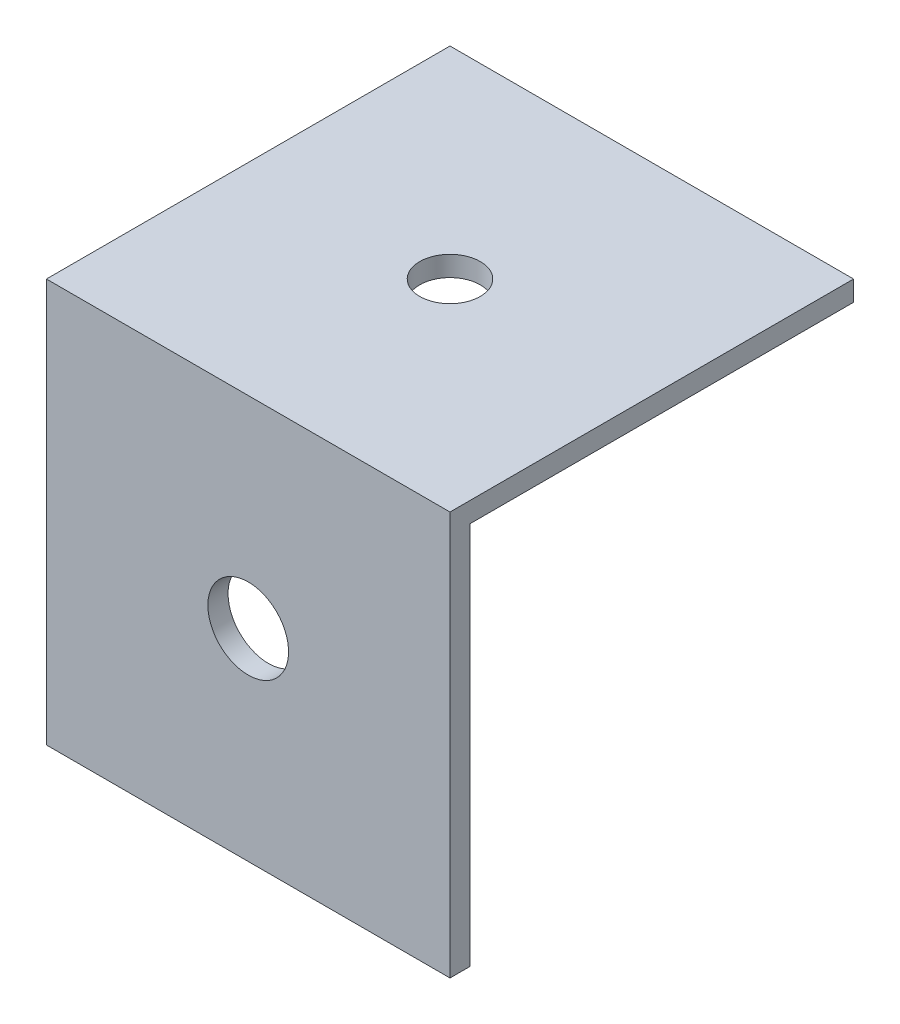
ISO-10303-21;
HEADER;
FILE_DESCRIPTION(('STEP AP214'),'2;1');
FILE_NAME('part.step','',(''),(''),'','','');
FILE_SCHEMA(('AUTOMOTIVE_DESIGN { 1 0 10303 214 1 1 1 1 }'));
ENDSEC;
DATA;
#1=APPLICATION_CONTEXT('core data for automotive mechanical design processes');
#2=APPLICATION_PROTOCOL_DEFINITION('international standard','automotive_design',2000,#1);
#3=PRODUCT_CONTEXT('',#1,'mechanical');
#4=PRODUCT('Part','Part','',(#3));
#5=PRODUCT_RELATED_PRODUCT_CATEGORY('part','',(#4));
#6=PRODUCT_DEFINITION_FORMATION('','',#4);
#7=PRODUCT_DEFINITION_CONTEXT('part definition',#1,'design');
#8=PRODUCT_DEFINITION('design','',#6,#7);
#9=PRODUCT_DEFINITION_SHAPE('','',#8);
#10=(LENGTH_UNIT() NAMED_UNIT(*) SI_UNIT(.MILLI.,.METRE.));
#11=(NAMED_UNIT(*) PLANE_ANGLE_UNIT() SI_UNIT($,.RADIAN.));
#12=(NAMED_UNIT(*) SI_UNIT($,.STERADIAN.) SOLID_ANGLE_UNIT());
#13=UNCERTAINTY_MEASURE_WITH_UNIT(LENGTH_MEASURE(1.E-05),#10,'distance_accuracy_value','');
#14=(GEOMETRIC_REPRESENTATION_CONTEXT(3) GLOBAL_UNCERTAINTY_ASSIGNED_CONTEXT((#13)) GLOBAL_UNIT_ASSIGNED_CONTEXT((#10,
#11,#12)) REPRESENTATION_CONTEXT('',''));
#15=CARTESIAN_POINT('',(0.,0.,0.));
#16=DIRECTION('',(0.,0.,1.));
#17=DIRECTION('',(1.,0.,0.));
#18=AXIS2_PLACEMENT_3D('',#15,#16,#17);
#19=CARTESIAN_POINT('',(20.,0.,-1.));
#20=DIRECTION('',(0.,1.,0.));
#21=DIRECTION('',(0.,0.,1.));
#22=AXIS2_PLACEMENT_3D('',#19,#20,#21);
#23=PLANE('',#22);
#24=DIRECTION('',(0.,0.,-1.));
#25=VECTOR('',#24,1.);
#26=CARTESIAN_POINT('',(0.,0.,-1.));
#27=LINE('',#26,#25);
#28=CARTESIAN_POINT('',(0.,0.,0.));
#29=VERTEX_POINT('',#28);
#30=CARTESIAN_POINT('',(0.,0.,-1.));
#31=VERTEX_POINT('',#30);
#32=EDGE_CURVE('E117',#29,#31,#27,.T.);
#33=ORIENTED_EDGE('',*,*,#32,.T.);
#34=DIRECTION('',(-1.,0.,0.));
#35=VECTOR('',#34,1.);
#36=CARTESIAN_POINT('',(20.,0.,-1.));
#37=LINE('',#36,#35);
#38=CARTESIAN_POINT('',(20.,0.,-1.));
#39=VERTEX_POINT('',#38);
#40=EDGE_CURVE('E11',#39,#31,#37,.T.);
#41=ORIENTED_EDGE('',*,*,#40,.F.);
#42=DIRECTION('',(0.,0.,-1.));
#43=VECTOR('',#42,1.);
#44=CARTESIAN_POINT('',(20.,0.,-1.));
#45=LINE('',#44,#43);
#46=CARTESIAN_POINT('',(20.,0.,0.));
#47=VERTEX_POINT('',#46);
#48=EDGE_CURVE('E128',#47,#39,#45,.T.);
#49=ORIENTED_EDGE('',*,*,#48,.F.);
#50=DIRECTION('',(-1.,0.,0.));
#51=VECTOR('',#50,1.);
#52=CARTESIAN_POINT('',(20.,0.,0.));
#53=LINE('',#52,#51);
#54=EDGE_CURVE('E113',#47,#29,#53,.T.);
#55=ORIENTED_EDGE('',*,*,#54,.T.);
#56=EDGE_LOOP('',(#33,#41,#49,#55));
#57=FACE_BOUND('',#56,.T.);
#58=ADVANCED_FACE('F33',(#57),#23,.F.);
#59=CARTESIAN_POINT('',(20.,19.,-1.));
#60=DIRECTION('',(0.,0.,1.));
#61=DIRECTION('',(1.,0.,0.));
#62=AXIS2_PLACEMENT_3D('',#59,#60,#61);
#63=PLANE('',#62);
#64=CARTESIAN_POINT('',(10.,10.,-1.));
#65=DIRECTION('',(0.,0.,-1.));
#66=DIRECTION('',(-1.,0.,0.));
#67=AXIS2_PLACEMENT_3D('',#64,#65,#66);
#68=CIRCLE('',#67,2.);
#69=CARTESIAN_POINT('',(8.,10.,-1.));
#70=VERTEX_POINT('',#69);
#71=EDGE_CURVE('E234',#70,#70,#68,.T.);
#72=ORIENTED_EDGE('',*,*,#71,.F.);
#73=EDGE_LOOP('',(#72));
#74=FACE_BOUND('',#73,.T.);
#75=DIRECTION('',(0.,1.,0.));
#76=VECTOR('',#75,1.);
#77=CARTESIAN_POINT('',(0.,19.,-1.));
#78=LINE('',#77,#76);
#79=CARTESIAN_POINT('',(0.,19.,-1.));
#80=VERTEX_POINT('',#79);
#81=EDGE_CURVE('E120',#31,#80,#78,.T.);
#82=ORIENTED_EDGE('',*,*,#81,.T.);
#83=DIRECTION('',(-1.,0.,0.));
#84=VECTOR('',#83,1.);
#85=CARTESIAN_POINT('',(20.,19.,-1.));
#86=LINE('',#85,#84);
#87=CARTESIAN_POINT('',(20.,19.,-1.));
#88=VERTEX_POINT('',#87);
#89=EDGE_CURVE('E41',#88,#80,#86,.T.);
#90=ORIENTED_EDGE('',*,*,#89,.F.);
#91=DIRECTION('',(0.,1.,0.));
#92=VECTOR('',#91,1.);
#93=CARTESIAN_POINT('',(20.,19.,-1.));
#94=LINE('',#93,#92);
#95=EDGE_CURVE('E86',#39,#88,#94,.T.);
#96=ORIENTED_EDGE('',*,*,#95,.F.);
#97=ORIENTED_EDGE('',*,*,#40,.T.);
#98=EDGE_LOOP('',(#82,#90,#96,#97));
#99=FACE_BOUND('',#98,.T.);
#100=ADVANCED_FACE('F155',(#74,#99),#63,.F.);
#101=CARTESIAN_POINT('',(20.,19.,-20.));
#102=DIRECTION('',(0.,1.,0.));
#103=DIRECTION('',(0.,0.,1.));
#104=AXIS2_PLACEMENT_3D('',#101,#102,#103);
#105=PLANE('',#104);
#106=CARTESIAN_POINT('',(10.,19.,-10.));
#107=DIRECTION('',(0.,-1.,0.));
#108=DIRECTION('',(0.,0.,-1.));
#109=AXIS2_PLACEMENT_3D('',#106,#107,#108);
#110=CIRCLE('',#109,1.5);
#111=CARTESIAN_POINT('',(10.,19.,-11.5));
#112=VERTEX_POINT('',#111);
#113=EDGE_CURVE('E239',#112,#112,#110,.T.);
#114=ORIENTED_EDGE('',*,*,#113,.F.);
#115=EDGE_LOOP('',(#114));
#116=FACE_BOUND('',#115,.T.);
#117=DIRECTION('',(0.,0.,-1.));
#118=VECTOR('',#117,1.);
#119=CARTESIAN_POINT('',(0.,19.,-20.));
#120=LINE('',#119,#118);
#121=CARTESIAN_POINT('',(0.,19.,-20.));
#122=VERTEX_POINT('',#121);
#123=EDGE_CURVE('E123',#80,#122,#120,.T.);
#124=ORIENTED_EDGE('',*,*,#123,.T.);
#125=DIRECTION('',(-1.,0.,0.));
#126=VECTOR('',#125,1.);
#127=CARTESIAN_POINT('',(20.,19.,-20.));
#128=LINE('',#127,#126);
#129=CARTESIAN_POINT('',(20.,19.,-20.));
#130=VERTEX_POINT('',#129);
#131=EDGE_CURVE('E108',#130,#122,#128,.T.);
#132=ORIENTED_EDGE('',*,*,#131,.F.);
#133=DIRECTION('',(0.,0.,-1.));
#134=VECTOR('',#133,1.);
#135=CARTESIAN_POINT('',(20.,19.,-20.));
#136=LINE('',#135,#134);
#137=EDGE_CURVE('E99',#88,#130,#136,.T.);
#138=ORIENTED_EDGE('',*,*,#137,.F.);
#139=ORIENTED_EDGE('',*,*,#89,.T.);
#140=EDGE_LOOP('',(#124,#132,#138,#139));
#141=FACE_BOUND('',#140,.T.);
#142=ADVANCED_FACE('F134',(#116,#141),#105,.F.);
#143=CARTESIAN_POINT('',(20.,20.,-20.));
#144=DIRECTION('',(0.,0.,1.));
#145=DIRECTION('',(1.,0.,0.));
#146=AXIS2_PLACEMENT_3D('',#143,#144,#145);
#147=PLANE('',#146);
#148=DIRECTION('',(0.,1.,0.));
#149=VECTOR('',#148,1.);
#150=CARTESIAN_POINT('',(0.,20.,-20.));
#151=LINE('',#150,#149);
#152=CARTESIAN_POINT('',(0.,20.,-20.));
#153=VERTEX_POINT('',#152);
#154=EDGE_CURVE('E107',#122,#153,#151,.T.);
#155=ORIENTED_EDGE('',*,*,#154,.T.);
#156=DIRECTION('',(-1.,0.,0.));
#157=VECTOR('',#156,1.);
#158=CARTESIAN_POINT('',(20.,20.,-20.));
#159=LINE('',#158,#157);
#160=CARTESIAN_POINT('',(20.,20.,-20.));
#161=VERTEX_POINT('',#160);
#162=EDGE_CURVE('E104',#161,#153,#159,.T.);
#163=ORIENTED_EDGE('',*,*,#162,.F.);
#164=DIRECTION('',(0.,1.,0.));
#165=VECTOR('',#164,1.);
#166=CARTESIAN_POINT('',(20.,20.,-20.));
#167=LINE('',#166,#165);
#168=EDGE_CURVE('E93',#130,#161,#167,.T.);
#169=ORIENTED_EDGE('',*,*,#168,.F.);
#170=ORIENTED_EDGE('',*,*,#131,.T.);
#171=EDGE_LOOP('',(#155,#163,#169,#170));
#172=FACE_BOUND('',#171,.T.);
#173=ADVANCED_FACE('F105',(#172),#147,.F.);
#174=CARTESIAN_POINT('',(20.,20.,0.));
#175=DIRECTION('',(0.,-1.,0.));
#176=DIRECTION('',(0.,0.,-1.));
#177=AXIS2_PLACEMENT_3D('',#174,#175,#176);
#178=PLANE('',#177);
#179=CARTESIAN_POINT('',(10.,20.,-10.));
#180=DIRECTION('',(0.,-1.,0.));
#181=DIRECTION('',(0.,0.,-1.));
#182=AXIS2_PLACEMENT_3D('',#179,#180,#181);
#183=CIRCLE('',#182,1.5);
#184=CARTESIAN_POINT('',(10.,20.,-11.5));
#185=VERTEX_POINT('',#184);
#186=EDGE_CURVE('E235',#185,#185,#183,.T.);
#187=ORIENTED_EDGE('',*,*,#186,.T.);
#188=EDGE_LOOP('',(#187));
#189=FACE_BOUND('',#188,.T.);
#190=DIRECTION('',(0.,0.,1.));
#191=VECTOR('',#190,1.);
#192=CARTESIAN_POINT('',(0.,20.,0.));
#193=LINE('',#192,#191);
#194=CARTESIAN_POINT('',(0.,20.,0.));
#195=VERTEX_POINT('',#194);
#196=EDGE_CURVE('E72',#153,#195,#193,.T.);
#197=ORIENTED_EDGE('',*,*,#196,.T.);
#198=DIRECTION('',(-1.,0.,0.));
#199=VECTOR('',#198,1.);
#200=CARTESIAN_POINT('',(20.,20.,0.));
#201=LINE('',#200,#199);
#202=CARTESIAN_POINT('',(20.,20.,0.));
#203=VERTEX_POINT('',#202);
#204=EDGE_CURVE('E109',#203,#195,#201,.T.);
#205=ORIENTED_EDGE('',*,*,#204,.F.);
#206=DIRECTION('',(0.,0.,1.));
#207=VECTOR('',#206,1.);
#208=CARTESIAN_POINT('',(20.,20.,0.));
#209=LINE('',#208,#207);
#210=EDGE_CURVE('E97',#161,#203,#209,.T.);
#211=ORIENTED_EDGE('',*,*,#210,.F.);
#212=ORIENTED_EDGE('',*,*,#162,.T.);
#213=EDGE_LOOP('',(#197,#205,#211,#212));
#214=FACE_BOUND('',#213,.T.);
#215=ADVANCED_FACE('F111',(#189,#214),#178,.F.);
#216=CARTESIAN_POINT('',(20.,0.,0.));
#217=DIRECTION('',(0.,0.,-1.));
#218=DIRECTION('',(-1.,0.,0.));
#219=AXIS2_PLACEMENT_3D('',#216,#217,#218);
#220=PLANE('',#219);
#221=CARTESIAN_POINT('',(10.,10.,0.));
#222=DIRECTION('',(0.,0.,-1.));
#223=DIRECTION('',(-1.,0.,0.));
#224=AXIS2_PLACEMENT_3D('',#221,#222,#223);
#225=CIRCLE('',#224,2.);
#226=CARTESIAN_POINT('',(8.,10.,0.));
#227=VERTEX_POINT('',#226);
#228=EDGE_CURVE('E121',#227,#227,#225,.T.);
#229=ORIENTED_EDGE('',*,*,#228,.T.);
#230=EDGE_LOOP('',(#229));
#231=FACE_BOUND('',#230,.T.);
#232=DIRECTION('',(0.,-1.,0.));
#233=VECTOR('',#232,1.);
#234=CARTESIAN_POINT('',(0.,0.,0.));
#235=LINE('',#234,#233);
#236=EDGE_CURVE('E78',#195,#29,#235,.T.);
#237=ORIENTED_EDGE('',*,*,#236,.T.);
#238=ORIENTED_EDGE('',*,*,#54,.F.);
#239=DIRECTION('',(0.,-1.,0.));
#240=VECTOR('',#239,1.);
#241=CARTESIAN_POINT('',(20.,0.,0.));
#242=LINE('',#241,#240);
#243=EDGE_CURVE('E49',#203,#47,#242,.T.);
#244=ORIENTED_EDGE('',*,*,#243,.F.);
#245=ORIENTED_EDGE('',*,*,#204,.T.);
#246=EDGE_LOOP('',(#237,#238,#244,#245));
#247=FACE_BOUND('',#246,.T.);
#248=ADVANCED_FACE('F141',(#231,#247),#220,.F.);
#249=CARTESIAN_POINT('',(20.,0.,0.));
#250=DIRECTION('',(-1.,0.,0.));
#251=DIRECTION('',(0.,0.,1.));
#252=AXIS2_PLACEMENT_3D('',#249,#250,#251);
#253=PLANE('',#252);
#254=ORIENTED_EDGE('',*,*,#48,.T.);
#255=ORIENTED_EDGE('',*,*,#95,.T.);
#256=ORIENTED_EDGE('',*,*,#137,.T.);
#257=ORIENTED_EDGE('',*,*,#168,.T.);
#258=ORIENTED_EDGE('',*,*,#210,.T.);
#259=ORIENTED_EDGE('',*,*,#243,.T.);
#260=EDGE_LOOP('',(#254,#255,#256,#257,#258,#259));
#261=FACE_BOUND('',#260,.T.);
#262=ADVANCED_FACE('F95',(#261),#253,.F.);
#263=CARTESIAN_POINT('',(0.,0.,0.));
#264=DIRECTION('',(-1.,0.,0.));
#265=DIRECTION('',(0.,0.,1.));
#266=AXIS2_PLACEMENT_3D('',#263,#264,#265);
#267=PLANE('',#266);
#268=ORIENTED_EDGE('',*,*,#32,.F.);
#269=ORIENTED_EDGE('',*,*,#236,.F.);
#270=ORIENTED_EDGE('',*,*,#196,.F.);
#271=ORIENTED_EDGE('',*,*,#154,.F.);
#272=ORIENTED_EDGE('',*,*,#123,.F.);
#273=ORIENTED_EDGE('',*,*,#81,.F.);
#274=EDGE_LOOP('',(#268,#269,#270,#271,#272,#273));
#275=FACE_BOUND('',#274,.T.);
#276=ADVANCED_FACE('F137',(#275),#267,.T.);
#277=CARTESIAN_POINT('',(10.,10.,0.));
#278=DIRECTION('',(0.,0.,-1.));
#279=DIRECTION('',(-1.,0.,0.));
#280=AXIS2_PLACEMENT_3D('',#277,#278,#279);
#281=CYLINDRICAL_SURFACE('',#280,2.);
#282=ORIENTED_EDGE('',*,*,#228,.F.);
#283=EDGE_LOOP('',(#282));
#284=FACE_BOUND('',#283,.T.);
#285=ORIENTED_EDGE('',*,*,#71,.T.);
#286=EDGE_LOOP('',(#285));
#287=FACE_BOUND('',#286,.T.);
#288=ADVANCED_FACE('F190',(#284,#287),#281,.F.);
#289=CARTESIAN_POINT('',(10.,20.,-10.));
#290=DIRECTION('',(0.,-1.,0.));
#291=DIRECTION('',(0.,0.,-1.));
#292=AXIS2_PLACEMENT_3D('',#289,#290,#291);
#293=CYLINDRICAL_SURFACE('',#292,1.5);
#294=ORIENTED_EDGE('',*,*,#186,.F.);
#295=EDGE_LOOP('',(#294));
#296=FACE_BOUND('',#295,.T.);
#297=ORIENTED_EDGE('',*,*,#113,.T.);
#298=EDGE_LOOP('',(#297));
#299=FACE_BOUND('',#298,.T.);
#300=ADVANCED_FACE('F186',(#296,#299),#293,.F.);
#301=CLOSED_SHELL('',(#58,#100,#142,#173,#215,#248,#262,#276,#288,#300));
#302=MANIFOLD_SOLID_BREP('B2',#301);
#303=ADVANCED_BREP_SHAPE_REPRESENTATION('',(#18,#302),#14);
#304=SHAPE_DEFINITION_REPRESENTATION(#9,#303);
ENDSEC;
END-ISO-10303-21;
